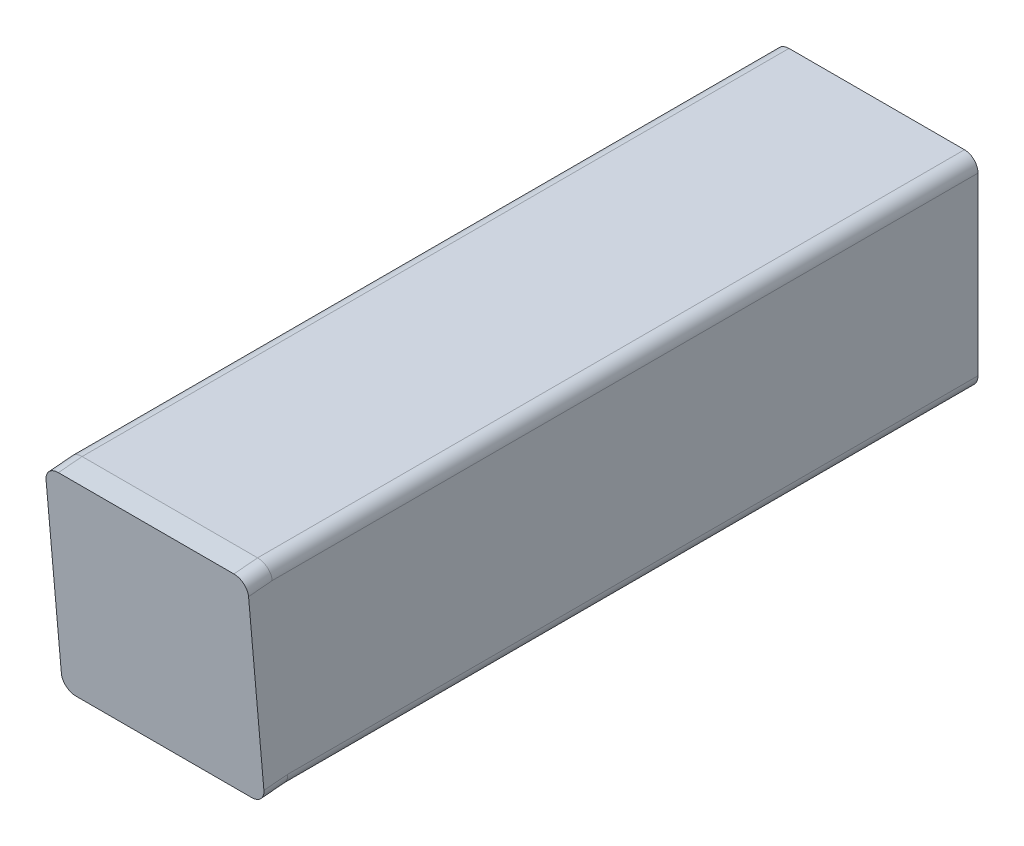
ISO-10303-21;
HEADER;
FILE_DESCRIPTION(('STEP AP214'),'2;1');
FILE_NAME('part.step','',(''),(''),'','','');
FILE_SCHEMA(('AUTOMOTIVE_DESIGN { 1 0 10303 214 1 1 1 1 }'));
ENDSEC;
DATA;
#1=APPLICATION_CONTEXT('core data for automotive mechanical design processes');
#2=APPLICATION_PROTOCOL_DEFINITION('international standard','automotive_design',2000,#1);
#3=PRODUCT_CONTEXT('',#1,'mechanical');
#4=PRODUCT('Part','Part','',(#3));
#5=PRODUCT_RELATED_PRODUCT_CATEGORY('part','',(#4));
#6=PRODUCT_DEFINITION_FORMATION('','',#4);
#7=PRODUCT_DEFINITION_CONTEXT('part definition',#1,'design');
#8=PRODUCT_DEFINITION('design','',#6,#7);
#9=PRODUCT_DEFINITION_SHAPE('','',#8);
#10=(LENGTH_UNIT() NAMED_UNIT(*) SI_UNIT(.MILLI.,.METRE.));
#11=(NAMED_UNIT(*) PLANE_ANGLE_UNIT() SI_UNIT($,.RADIAN.));
#12=(NAMED_UNIT(*) SI_UNIT($,.STERADIAN.) SOLID_ANGLE_UNIT());
#13=UNCERTAINTY_MEASURE_WITH_UNIT(LENGTH_MEASURE(1.E-05),#10,'distance_accuracy_value','');
#14=(GEOMETRIC_REPRESENTATION_CONTEXT(3) GLOBAL_UNCERTAINTY_ASSIGNED_CONTEXT((#13)) GLOBAL_UNIT_ASSIGNED_CONTEXT((#10,
#11,#12)) REPRESENTATION_CONTEXT('',''));
#15=CARTESIAN_POINT('',(0.,0.,0.));
#16=DIRECTION('',(0.,0.,1.));
#17=DIRECTION('',(1.,0.,0.));
#18=AXIS2_PLACEMENT_3D('',#15,#16,#17);
#19=CARTESIAN_POINT('',(2.54,-35.56,0.));
#20=DIRECTION('',(0.,0.,1.));
#21=DIRECTION('',(1.,0.,0.));
#22=AXIS2_PLACEMENT_3D('',#19,#20,#21);
#23=PLANE('',#22);
#24=CARTESIAN_POINT('',(2.54,-35.56,0.));
#25=DIRECTION('',(0.,0.,1.));
#26=DIRECTION('',(1.,0.,0.));
#27=AXIS2_PLACEMENT_3D('',#24,#25,#26);
#28=CIRCLE('',#27,2.54);
#29=CARTESIAN_POINT('',(0.,-35.56,0.));
#30=VERTEX_POINT('',#29);
#31=CARTESIAN_POINT('',(2.54000000000002,-38.1,0.));
#32=VERTEX_POINT('',#31);
#33=EDGE_CURVE('E360',#30,#32,#28,.T.);
#34=ORIENTED_EDGE('',*,*,#33,.F.);
#35=DIRECTION('',(0.,-1.,0.));
#36=VECTOR('',#35,1.);
#37=CARTESIAN_POINT('',(0.,-2.54000000000002,0.));
#38=LINE('',#37,#36);
#39=CARTESIAN_POINT('',(0.,-2.54000000000002,0.));
#40=VERTEX_POINT('',#39);
#41=EDGE_CURVE('E344',#40,#30,#38,.T.);
#42=ORIENTED_EDGE('',*,*,#41,.F.);
#43=CARTESIAN_POINT('',(2.54,-2.54,0.));
#44=DIRECTION('',(0.,0.,1.));
#45=DIRECTION('',(-1.,0.,0.));
#46=AXIS2_PLACEMENT_3D('',#43,#44,#45);
#47=CIRCLE('',#46,2.54);
#48=CARTESIAN_POINT('',(2.54000000000002,0.,0.));
#49=VERTEX_POINT('',#48);
#50=EDGE_CURVE('E347',#49,#40,#47,.T.);
#51=ORIENTED_EDGE('',*,*,#50,.F.);
#52=DIRECTION('',(-1.,0.,0.));
#53=VECTOR('',#52,1.);
#54=CARTESIAN_POINT('',(2.54000000000002,0.,0.));
#55=LINE('',#54,#53);
#56=CARTESIAN_POINT('',(35.56,0.,0.));
#57=VERTEX_POINT('',#56);
#58=EDGE_CURVE('E350',#57,#49,#55,.T.);
#59=ORIENTED_EDGE('',*,*,#58,.F.);
#60=CARTESIAN_POINT('',(35.56,-2.54,0.));
#61=DIRECTION('',(0.,0.,1.));
#62=DIRECTION('',(1.,0.,0.));
#63=AXIS2_PLACEMENT_3D('',#60,#61,#62);
#64=CIRCLE('',#63,2.54);
#65=CARTESIAN_POINT('',(38.1,-2.54000000000002,0.));
#66=VERTEX_POINT('',#65);
#67=EDGE_CURVE('E352',#66,#57,#64,.T.);
#68=ORIENTED_EDGE('',*,*,#67,.F.);
#69=DIRECTION('',(0.,1.,0.));
#70=VECTOR('',#69,1.);
#71=CARTESIAN_POINT('',(38.1,-2.54000000000002,0.));
#72=LINE('',#71,#70);
#73=CARTESIAN_POINT('',(38.1,-35.56,0.));
#74=VERTEX_POINT('',#73);
#75=EDGE_CURVE('E354',#74,#66,#72,.T.);
#76=ORIENTED_EDGE('',*,*,#75,.F.);
#77=CARTESIAN_POINT('',(35.56,-35.56,0.));
#78=DIRECTION('',(0.,0.,1.));
#79=DIRECTION('',(-1.,0.,0.));
#80=AXIS2_PLACEMENT_3D('',#77,#78,#79);
#81=CIRCLE('',#80,2.54);
#82=CARTESIAN_POINT('',(35.56,-38.1,0.));
#83=VERTEX_POINT('',#82);
#84=EDGE_CURVE('E357',#83,#74,#81,.T.);
#85=ORIENTED_EDGE('',*,*,#84,.F.);
#86=DIRECTION('',(1.,0.,0.));
#87=VECTOR('',#86,1.);
#88=CARTESIAN_POINT('',(2.54000000000002,-38.1,0.));
#89=LINE('',#88,#87);
#90=EDGE_CURVE('E323',#32,#83,#89,.T.);
#91=ORIENTED_EDGE('',*,*,#90,.F.);
#92=EDGE_LOOP('',(#34,#42,#51,#59,#68,#76,#85,#91));
#93=FACE_BOUND('',#92,.T.);
#94=CARTESIAN_POINT('',(5.3086,-32.7914,0.));
#95=DIRECTION('',(0.,0.,1.));
#96=DIRECTION('',(1.,0.,0.));
#97=AXIS2_PLACEMENT_3D('',#94,#95,#96);
#98=CIRCLE('',#97,2.54);
#99=CARTESIAN_POINT('',(2.7686,-32.7914,0.));
#100=VERTEX_POINT('',#99);
#101=CARTESIAN_POINT('',(5.30860000000002,-35.3314,0.));
#102=VERTEX_POINT('',#101);
#103=EDGE_CURVE('E402',#100,#102,#98,.T.);
#104=ORIENTED_EDGE('',*,*,#103,.T.);
#105=DIRECTION('',(1.,0.,0.));
#106=VECTOR('',#105,1.);
#107=CARTESIAN_POINT('',(5.30860000000002,-35.3314,0.));
#108=LINE('',#107,#106);
#109=CARTESIAN_POINT('',(32.7914,-35.3314,0.));
#110=VERTEX_POINT('',#109);
#111=EDGE_CURVE('E399',#102,#110,#108,.T.);
#112=ORIENTED_EDGE('',*,*,#111,.T.);
#113=CARTESIAN_POINT('',(32.7914,-32.7914,0.));
#114=DIRECTION('',(0.,0.,1.));
#115=DIRECTION('',(1.,0.,0.));
#116=AXIS2_PLACEMENT_3D('',#113,#114,#115);
#117=CIRCLE('',#116,2.54);
#118=CARTESIAN_POINT('',(35.3314,-32.7914,0.));
#119=VERTEX_POINT('',#118);
#120=EDGE_CURVE('E396',#110,#119,#117,.T.);
#121=ORIENTED_EDGE('',*,*,#120,.T.);
#122=DIRECTION('',(0.,1.,0.));
#123=VECTOR('',#122,1.);
#124=CARTESIAN_POINT('',(35.3314,-5.30860000000002,0.));
#125=LINE('',#124,#123);
#126=CARTESIAN_POINT('',(35.3314,-5.30860000000002,0.));
#127=VERTEX_POINT('',#126);
#128=EDGE_CURVE('E393',#119,#127,#125,.T.);
#129=ORIENTED_EDGE('',*,*,#128,.T.);
#130=CARTESIAN_POINT('',(32.7914,-5.3086,0.));
#131=DIRECTION('',(0.,0.,1.));
#132=DIRECTION('',(1.,0.,0.));
#133=AXIS2_PLACEMENT_3D('',#130,#131,#132);
#134=CIRCLE('',#133,2.54);
#135=CARTESIAN_POINT('',(32.7914,-2.7686,0.));
#136=VERTEX_POINT('',#135);
#137=EDGE_CURVE('E390',#127,#136,#134,.T.);
#138=ORIENTED_EDGE('',*,*,#137,.T.);
#139=DIRECTION('',(-1.,0.,0.));
#140=VECTOR('',#139,1.);
#141=CARTESIAN_POINT('',(5.30860000000002,-2.7686,0.));
#142=LINE('',#141,#140);
#143=CARTESIAN_POINT('',(5.30860000000002,-2.7686,0.));
#144=VERTEX_POINT('',#143);
#145=EDGE_CURVE('E387',#136,#144,#142,.T.);
#146=ORIENTED_EDGE('',*,*,#145,.T.);
#147=CARTESIAN_POINT('',(5.3086,-5.3086,0.));
#148=DIRECTION('',(0.,0.,1.));
#149=DIRECTION('',(1.,0.,0.));
#150=AXIS2_PLACEMENT_3D('',#147,#148,#149);
#151=CIRCLE('',#150,2.54);
#152=CARTESIAN_POINT('',(2.7686,-5.30860000000002,0.));
#153=VERTEX_POINT('',#152);
#154=EDGE_CURVE('E384',#144,#153,#151,.T.);
#155=ORIENTED_EDGE('',*,*,#154,.T.);
#156=DIRECTION('',(0.,-1.,0.));
#157=VECTOR('',#156,1.);
#158=CARTESIAN_POINT('',(2.7686,-5.30860000000002,0.));
#159=LINE('',#158,#157);
#160=EDGE_CURVE('E381',#153,#100,#159,.T.);
#161=ORIENTED_EDGE('',*,*,#160,.T.);
#162=EDGE_LOOP('',(#104,#112,#121,#129,#138,#146,#155,#161));
#163=FACE_BOUND('',#162,.T.);
#164=ADVANCED_FACE('F35',(#93,#163),#23,.F.);
#165=CARTESIAN_POINT('',(2.54,-35.56,133.));
#166=DIRECTION('',(0.,0.,-1.));
#167=DIRECTION('',(-1.,0.,0.));
#168=AXIS2_PLACEMENT_3D('',#165,#166,#167);
#169=CYLINDRICAL_SURFACE('',#168,2.54);
#170=DIRECTION('',(0.,0.,-1.));
#171=VECTOR('',#170,1.);
#172=CARTESIAN_POINT('',(2.54000000000002,-38.1,133.));
#173=LINE('',#172,#171);
#174=CARTESIAN_POINT('',(2.54000000000002,-38.1,129.666681919663));
#175=VERTEX_POINT('',#174);
#176=EDGE_CURVE('E43',#175,#32,#173,.T.);
#177=ORIENTED_EDGE('',*,*,#176,.F.);
#178=CARTESIAN_POINT('',(2.54,-35.56,129.888903125018));
#179=DIRECTION('',(0.,0.0871557427476518,-0.996194698091746));
#180=DIRECTION('',(0.,-0.996194698091746,-0.0871557427476518));
#181=AXIS2_PLACEMENT_3D('',#178,#179,#180);
#182=ELLIPSE('',#181,2.5497023873601,2.54);
#183=CARTESIAN_POINT('',(0.,-35.56,129.888903125018));
#184=VERTEX_POINT('',#183);
#185=EDGE_CURVE('E405',#175,#184,#182,.T.);
#186=ORIENTED_EDGE('',*,*,#185,.T.);
#187=DIRECTION('',(0.,0.,-1.));
#188=VECTOR('',#187,1.);
#189=CARTESIAN_POINT('',(0.,-35.56,133.));
#190=LINE('',#189,#188);
#191=EDGE_CURVE('E341',#184,#30,#190,.T.);
#192=ORIENTED_EDGE('',*,*,#191,.T.);
#193=ORIENTED_EDGE('',*,*,#33,.T.);
#194=EDGE_LOOP('',(#177,#186,#192,#193));
#195=FACE_BOUND('',#194,.T.);
#196=ADVANCED_FACE('F37',(#195),#169,.T.);
#197=CARTESIAN_POINT('',(2.54000000000002,-38.1,133.));
#198=DIRECTION('',(0.,1.,0.));
#199=DIRECTION('',(0.,0.,1.));
#200=AXIS2_PLACEMENT_3D('',#197,#198,#199);
#201=PLANE('',#200);
#202=DIRECTION('',(0.,0.,-1.));
#203=VECTOR('',#202,1.);
#204=CARTESIAN_POINT('',(35.56,-38.1,133.));
#205=LINE('',#204,#203);
#206=CARTESIAN_POINT('',(35.56,-38.1,129.666681919663));
#207=VERTEX_POINT('',#206);
#208=EDGE_CURVE('E320',#207,#83,#205,.T.);
#209=ORIENTED_EDGE('',*,*,#208,.F.);
#210=DIRECTION('',(1.,0.,0.));
#211=VECTOR('',#210,1.);
#212=CARTESIAN_POINT('',(0.,-38.1,129.666681919663));
#213=LINE('',#212,#211);
#214=EDGE_CURVE('E191',#175,#207,#213,.T.);
#215=ORIENTED_EDGE('',*,*,#214,.F.);
#216=ORIENTED_EDGE('',*,*,#176,.T.);
#217=ORIENTED_EDGE('',*,*,#90,.T.);
#218=EDGE_LOOP('',(#209,#215,#216,#217));
#219=FACE_BOUND('',#218,.T.);
#220=ADVANCED_FACE('F309',(#219),#201,.F.);
#221=CARTESIAN_POINT('',(35.56,-35.56,133.));
#222=DIRECTION('',(0.,0.,-1.));
#223=DIRECTION('',(-1.,0.,0.));
#224=AXIS2_PLACEMENT_3D('',#221,#222,#223);
#225=CYLINDRICAL_SURFACE('',#224,2.54);
#226=DIRECTION('',(0.,0.,-1.));
#227=VECTOR('',#226,1.);
#228=CARTESIAN_POINT('',(38.1,-35.56,133.));
#229=LINE('',#228,#227);
#230=CARTESIAN_POINT('',(38.1,-35.56,129.888903125018));
#231=VERTEX_POINT('',#230);
#232=EDGE_CURVE('E327',#231,#74,#229,.T.);
#233=ORIENTED_EDGE('',*,*,#232,.F.);
#234=CARTESIAN_POINT('',(35.56,-35.56,129.888903125018));
#235=DIRECTION('',(0.,0.0871557427476518,-0.996194698091746));
#236=DIRECTION('',(0.,-0.996194698091746,-0.0871557427476518));
#237=AXIS2_PLACEMENT_3D('',#234,#235,#236);
#238=ELLIPSE('',#237,2.5497023873601,2.54);
#239=EDGE_CURVE('E408',#231,#207,#238,.T.);
#240=ORIENTED_EDGE('',*,*,#239,.T.);
#241=ORIENTED_EDGE('',*,*,#208,.T.);
#242=ORIENTED_EDGE('',*,*,#84,.T.);
#243=EDGE_LOOP('',(#233,#240,#241,#242));
#244=FACE_BOUND('',#243,.T.);
#245=ADVANCED_FACE('F306',(#244),#225,.T.);
#246=CARTESIAN_POINT('',(38.1,-2.54000000000002,133.));
#247=DIRECTION('',(-1.,0.,0.));
#248=DIRECTION('',(0.,-1.,0.));
#249=AXIS2_PLACEMENT_3D('',#246,#247,#248);
#250=PLANE('',#249);
#251=DIRECTION('',(0.,0.,-1.));
#252=VECTOR('',#251,1.);
#253=CARTESIAN_POINT('',(38.1,-2.54000000000002,133.));
#254=LINE('',#253,#252);
#255=CARTESIAN_POINT('',(38.1,-2.54000000000001,132.777778794644));
#256=VERTEX_POINT('',#255);
#257=EDGE_CURVE('E329',#256,#66,#254,.T.);
#258=ORIENTED_EDGE('',*,*,#257,.F.);
#259=DIRECTION('',(0.,0.0871557427476518,-0.996194698091746));
#260=VECTOR('',#259,1.);
#261=CARTESIAN_POINT('',(38.1,-7.63559388855577,191.020683454472));
#262=LINE('',#261,#260);
#263=CARTESIAN_POINT('',(38.1,-2.93053084437793,137.241566771726));
#264=VERTEX_POINT('',#263);
#265=EDGE_CURVE('E216',#264,#256,#262,.T.);
#266=ORIENTED_EDGE('',*,*,#265,.F.);
#267=DIRECTION('',(0.,0.996194698091746,0.0871557427476584));
#268=VECTOR('',#267,1.);
#269=CARTESIAN_POINT('',(38.1,-35.9505308443787,134.352691102113));
#270=LINE('',#269,#268);
#271=CARTESIAN_POINT('',(38.1,-35.9505308443791,134.352691102113));
#272=VERTEX_POINT('',#271);
#273=EDGE_CURVE('E200',#272,#264,#270,.T.);
#274=ORIENTED_EDGE('',*,*,#273,.F.);
#275=DIRECTION('',(0.,0.0871557427476518,-0.996194698091746));
#276=VECTOR('',#275,1.);
#277=CARTESIAN_POINT('',(38.1,-40.6555938885558,188.131807784846));
#278=LINE('',#277,#276);
#279=EDGE_CURVE('E214',#272,#231,#278,.T.);
#280=ORIENTED_EDGE('',*,*,#279,.T.);
#281=ORIENTED_EDGE('',*,*,#232,.T.);
#282=ORIENTED_EDGE('',*,*,#75,.T.);
#283=EDGE_LOOP('',(#258,#266,#274,#280,#281,#282));
#284=FACE_BOUND('',#283,.T.);
#285=ADVANCED_FACE('F302',(#284),#250,.F.);
#286=CARTESIAN_POINT('',(35.56,-2.54,133.));
#287=DIRECTION('',(0.,0.,-1.));
#288=DIRECTION('',(-1.,0.,0.));
#289=AXIS2_PLACEMENT_3D('',#286,#287,#288);
#290=CYLINDRICAL_SURFACE('',#289,2.54);
#291=DIRECTION('',(0.,0.,-1.));
#292=VECTOR('',#291,1.);
#293=CARTESIAN_POINT('',(35.56,0.,133.));
#294=LINE('',#293,#292);
#295=CARTESIAN_POINT('',(35.56,0.,133.));
#296=VERTEX_POINT('',#295);
#297=EDGE_CURVE('E333',#296,#57,#294,.T.);
#298=ORIENTED_EDGE('',*,*,#297,.F.);
#299=CARTESIAN_POINT('',(35.56,-2.54,132.777778794644));
#300=DIRECTION('',(0.,0.0871557427476518,-0.996194698091746));
#301=DIRECTION('',(0.,-0.996194698091746,-0.0871557427476518));
#302=AXIS2_PLACEMENT_3D('',#299,#300,#301);
#303=ELLIPSE('',#302,2.5497023873601,2.54);
#304=EDGE_CURVE('E410',#296,#256,#303,.T.);
#305=ORIENTED_EDGE('',*,*,#304,.T.);
#306=ORIENTED_EDGE('',*,*,#257,.T.);
#307=ORIENTED_EDGE('',*,*,#67,.T.);
#308=EDGE_LOOP('',(#298,#305,#306,#307));
#309=FACE_BOUND('',#308,.T.);
#310=ADVANCED_FACE('F298',(#309),#290,.T.);
#311=CARTESIAN_POINT('',(2.54000000000002,0.,133.));
#312=DIRECTION('',(0.,-1.,0.));
#313=DIRECTION('',(0.,0.,-1.));
#314=AXIS2_PLACEMENT_3D('',#311,#312,#313);
#315=PLANE('',#314);
#316=ORIENTED_EDGE('',*,*,#58,.T.);
#317=DIRECTION('',(0.,0.,-1.));
#318=VECTOR('',#317,1.);
#319=CARTESIAN_POINT('',(2.54000000000002,0.,133.));
#320=LINE('',#319,#318);
#321=CARTESIAN_POINT('',(2.54,0.,133.));
#322=VERTEX_POINT('',#321);
#323=EDGE_CURVE('E336',#322,#49,#320,.T.);
#324=ORIENTED_EDGE('',*,*,#323,.F.);
#325=DIRECTION('',(-1.,0.,0.));
#326=VECTOR('',#325,1.);
#327=CARTESIAN_POINT('',(2.54000000000002,0.,133.));
#328=LINE('',#327,#326);
#329=EDGE_CURVE('E343',#296,#322,#328,.T.);
#330=ORIENTED_EDGE('',*,*,#329,.F.);
#331=ORIENTED_EDGE('',*,*,#297,.T.);
#332=EDGE_LOOP('',(#316,#324,#330,#331));
#333=FACE_BOUND('',#332,.T.);
#334=ADVANCED_FACE('F294',(#333),#315,.F.);
#335=CARTESIAN_POINT('',(2.54,-2.54,133.));
#336=DIRECTION('',(0.,0.,-1.));
#337=DIRECTION('',(-1.,0.,0.));
#338=AXIS2_PLACEMENT_3D('',#335,#336,#337);
#339=CYLINDRICAL_SURFACE('',#338,2.54);
#340=DIRECTION('',(0.,0.,-1.));
#341=VECTOR('',#340,1.);
#342=CARTESIAN_POINT('',(0.,-2.54000000000002,133.));
#343=LINE('',#342,#341);
#344=CARTESIAN_POINT('',(0.,-2.54000000000002,132.777778794644));
#345=VERTEX_POINT('',#344);
#346=EDGE_CURVE('E339',#345,#40,#343,.T.);
#347=ORIENTED_EDGE('',*,*,#346,.F.);
#348=CARTESIAN_POINT('',(2.54,-2.54,132.777778794644));
#349=DIRECTION('',(0.,0.0871557427476518,-0.996194698091746));
#350=DIRECTION('',(0.,-0.996194698091746,-0.0871557427476518));
#351=AXIS2_PLACEMENT_3D('',#348,#349,#350);
#352=ELLIPSE('',#351,2.5497023873601,2.54);
#353=EDGE_CURVE('E50',#345,#322,#352,.T.);
#354=ORIENTED_EDGE('',*,*,#353,.T.);
#355=ORIENTED_EDGE('',*,*,#323,.T.);
#356=ORIENTED_EDGE('',*,*,#50,.T.);
#357=EDGE_LOOP('',(#347,#354,#355,#356));
#358=FACE_BOUND('',#357,.T.);
#359=ADVANCED_FACE('F291',(#358),#339,.T.);
#360=CARTESIAN_POINT('',(0.,-2.54000000000002,133.));
#361=DIRECTION('',(1.,0.,0.));
#362=DIRECTION('',(0.,1.,0.));
#363=AXIS2_PLACEMENT_3D('',#360,#361,#362);
#364=PLANE('',#363);
#365=ORIENTED_EDGE('',*,*,#191,.F.);
#366=DIRECTION('',(0.,0.0871557427476518,-0.996194698091746));
#367=VECTOR('',#366,1.);
#368=CARTESIAN_POINT('',(0.,-40.6555938885558,188.131807784846));
#369=LINE('',#368,#367);
#370=CARTESIAN_POINT('',(0.,-35.9505308443791,134.352691102113));
#371=VERTEX_POINT('',#370);
#372=EDGE_CURVE('E181',#371,#184,#369,.T.);
#373=ORIENTED_EDGE('',*,*,#372,.F.);
#374=DIRECTION('',(0.,-0.996194698091746,-0.0871557427476584));
#375=VECTOR('',#374,1.);
#376=CARTESIAN_POINT('',(0.,-2.93053084437874,137.241566771739));
#377=LINE('',#376,#375);
#378=CARTESIAN_POINT('',(0.,-2.93053084437909,137.241566771739));
#379=VERTEX_POINT('',#378);
#380=EDGE_CURVE('E175',#379,#371,#377,.T.);
#381=ORIENTED_EDGE('',*,*,#380,.F.);
#382=DIRECTION('',(0.,0.0871557427476518,-0.996194698091746));
#383=VECTOR('',#382,1.);
#384=CARTESIAN_POINT('',(0.,-7.63559388855578,191.020683454472));
#385=LINE('',#384,#383);
#386=EDGE_CURVE('E167',#379,#345,#385,.T.);
#387=ORIENTED_EDGE('',*,*,#386,.T.);
#388=ORIENTED_EDGE('',*,*,#346,.T.);
#389=ORIENTED_EDGE('',*,*,#41,.T.);
#390=EDGE_LOOP('',(#365,#373,#381,#387,#388,#389));
#391=FACE_BOUND('',#390,.T.);
#392=ADVANCED_FACE('F180',(#391),#364,.F.);
#393=CARTESIAN_POINT('',(5.3086,-32.7914,133.));
#394=DIRECTION('',(0.,0.,-1.));
#395=DIRECTION('',(-1.,0.,0.));
#396=AXIS2_PLACEMENT_3D('',#393,#394,#395);
#397=CYLINDRICAL_SURFACE('',#396,2.54);
#398=CARTESIAN_POINT('',(5.3086,-32.7914,130.131124238856));
#399=DIRECTION('',(0.,0.0871557427476518,-0.996194698091746));
#400=DIRECTION('',(0.,-0.996194698091746,-0.0871557427476518));
#401=AXIS2_PLACEMENT_3D('',#398,#399,#400);
#402=ELLIPSE('',#401,2.5497023873601,2.54);
#403=CARTESIAN_POINT('',(5.30860000000002,-35.3314,129.9089030335));
#404=VERTEX_POINT('',#403);
#405=CARTESIAN_POINT('',(2.7686,-32.7914,130.131124238856));
#406=VERTEX_POINT('',#405);
#407=EDGE_CURVE('E414',#404,#406,#402,.T.);
#408=ORIENTED_EDGE('',*,*,#407,.F.);
#409=DIRECTION('',(0.,0.,-1.));
#410=VECTOR('',#409,1.);
#411=CARTESIAN_POINT('',(5.30860000000002,-35.3314,133.));
#412=LINE('',#411,#410);
#413=EDGE_CURVE('E363',#404,#102,#412,.T.);
#414=ORIENTED_EDGE('',*,*,#413,.T.);
#415=ORIENTED_EDGE('',*,*,#103,.F.);
#416=DIRECTION('',(0.,0.,-1.));
#417=VECTOR('',#416,1.);
#418=CARTESIAN_POINT('',(2.7686,-32.7914,133.));
#419=LINE('',#418,#417);
#420=EDGE_CURVE('E379',#406,#100,#419,.T.);
#421=ORIENTED_EDGE('',*,*,#420,.F.);
#422=EDGE_LOOP('',(#408,#414,#415,#421));
#423=FACE_BOUND('',#422,.T.);
#424=ADVANCED_FACE('F281',(#423),#397,.F.);
#425=CARTESIAN_POINT('',(5.30860000000002,-35.3314,133.));
#426=DIRECTION('',(0.,1.,0.));
#427=DIRECTION('',(0.,0.,1.));
#428=AXIS2_PLACEMENT_3D('',#425,#426,#427);
#429=PLANE('',#428);
#430=DIRECTION('',(-1.,0.,0.));
#431=VECTOR('',#430,1.);
#432=CARTESIAN_POINT('',(5.30860000000002,-35.3314,129.9089030335));
#433=LINE('',#432,#431);
#434=CARTESIAN_POINT('',(32.7914,-35.3314,129.9089030335));
#435=VERTEX_POINT('',#434);
#436=EDGE_CURVE('E417',#435,#404,#433,.T.);
#437=ORIENTED_EDGE('',*,*,#436,.F.);
#438=DIRECTION('',(0.,0.,-1.));
#439=VECTOR('',#438,1.);
#440=CARTESIAN_POINT('',(32.7914,-35.3314,133.));
#441=LINE('',#440,#439);
#442=EDGE_CURVE('E367',#435,#110,#441,.T.);
#443=ORIENTED_EDGE('',*,*,#442,.T.);
#444=ORIENTED_EDGE('',*,*,#111,.F.);
#445=ORIENTED_EDGE('',*,*,#413,.F.);
#446=EDGE_LOOP('',(#437,#443,#444,#445));
#447=FACE_BOUND('',#446,.T.);
#448=ADVANCED_FACE('F277',(#447),#429,.T.);
#449=CARTESIAN_POINT('',(32.7914,-32.7914,133.));
#450=DIRECTION('',(0.,0.,-1.));
#451=DIRECTION('',(-1.,0.,0.));
#452=AXIS2_PLACEMENT_3D('',#449,#450,#451);
#453=CYLINDRICAL_SURFACE('',#452,2.54);
#454=CARTESIAN_POINT('',(32.7914,-32.7914,130.131124238856));
#455=DIRECTION('',(0.,0.0871557427476518,-0.996194698091746));
#456=DIRECTION('',(0.,-0.996194698091746,-0.0871557427476518));
#457=AXIS2_PLACEMENT_3D('',#454,#455,#456);
#458=ELLIPSE('',#457,2.5497023873601,2.54);
#459=CARTESIAN_POINT('',(35.3314,-32.7914,130.131124238856));
#460=VERTEX_POINT('',#459);
#461=EDGE_CURVE('E420',#460,#435,#458,.T.);
#462=ORIENTED_EDGE('',*,*,#461,.F.);
#463=DIRECTION('',(0.,0.,-1.));
#464=VECTOR('',#463,1.);
#465=CARTESIAN_POINT('',(35.3314,-32.7914,133.));
#466=LINE('',#465,#464);
#467=EDGE_CURVE('E369',#460,#119,#466,.T.);
#468=ORIENTED_EDGE('',*,*,#467,.T.);
#469=ORIENTED_EDGE('',*,*,#120,.F.);
#470=ORIENTED_EDGE('',*,*,#442,.F.);
#471=EDGE_LOOP('',(#462,#468,#469,#470));
#472=FACE_BOUND('',#471,.T.);
#473=ADVANCED_FACE('F273',(#472),#453,.F.);
#474=CARTESIAN_POINT('',(35.3314,-5.30860000000002,133.));
#475=DIRECTION('',(-1.,0.,0.));
#476=DIRECTION('',(0.,0.,1.));
#477=AXIS2_PLACEMENT_3D('',#474,#475,#476);
#478=PLANE('',#477);
#479=DIRECTION('',(0.,-0.996194698091746,-0.0871557427476518));
#480=VECTOR('',#479,1.);
#481=CARTESIAN_POINT('',(35.3314,-5.26827521882033,132.539085642019));
#482=LINE('',#481,#480);
#483=CARTESIAN_POINT('',(35.3314,-5.30860000000002,132.535557680806));
#484=VERTEX_POINT('',#483);
#485=EDGE_CURVE('E423',#484,#460,#482,.T.);
#486=ORIENTED_EDGE('',*,*,#485,.F.);
#487=DIRECTION('',(0.,0.,-1.));
#488=VECTOR('',#487,1.);
#489=CARTESIAN_POINT('',(35.3314,-5.30860000000002,133.));
#490=LINE('',#489,#488);
#491=EDGE_CURVE('E371',#484,#127,#490,.T.);
#492=ORIENTED_EDGE('',*,*,#491,.T.);
#493=ORIENTED_EDGE('',*,*,#128,.F.);
#494=ORIENTED_EDGE('',*,*,#467,.F.);
#495=EDGE_LOOP('',(#486,#492,#493,#494));
#496=FACE_BOUND('',#495,.T.);
#497=ADVANCED_FACE('F269',(#496),#478,.T.);
#498=CARTESIAN_POINT('',(32.7914,-5.3086,133.));
#499=DIRECTION('',(0.,0.,-1.));
#500=DIRECTION('',(-1.,0.,0.));
#501=AXIS2_PLACEMENT_3D('',#498,#499,#500);
#502=CYLINDRICAL_SURFACE('',#501,2.54);
#503=CARTESIAN_POINT('',(32.7914,-5.3086,132.535557680806));
#504=DIRECTION('',(0.,0.0871557427476518,-0.996194698091746));
#505=DIRECTION('',(0.,-0.996194698091746,-0.0871557427476518));
#506=AXIS2_PLACEMENT_3D('',#503,#504,#505);
#507=ELLIPSE('',#506,2.5497023873601,2.54);
#508=CARTESIAN_POINT('',(32.7914,-2.7686,132.757778886162));
#509=VERTEX_POINT('',#508);
#510=EDGE_CURVE('E426',#509,#484,#507,.T.);
#511=ORIENTED_EDGE('',*,*,#510,.F.);
#512=DIRECTION('',(0.,0.,-1.));
#513=VECTOR('',#512,1.);
#514=CARTESIAN_POINT('',(32.7914,-2.7686,133.));
#515=LINE('',#514,#513);
#516=EDGE_CURVE('E373',#509,#136,#515,.T.);
#517=ORIENTED_EDGE('',*,*,#516,.T.);
#518=ORIENTED_EDGE('',*,*,#137,.F.);
#519=ORIENTED_EDGE('',*,*,#491,.F.);
#520=EDGE_LOOP('',(#511,#517,#518,#519));
#521=FACE_BOUND('',#520,.T.);
#522=ADVANCED_FACE('F265',(#521),#502,.F.);
#523=CARTESIAN_POINT('',(5.30860000000002,-2.7686,133.));
#524=DIRECTION('',(0.,-1.,0.));
#525=DIRECTION('',(0.,0.,-1.));
#526=AXIS2_PLACEMENT_3D('',#523,#524,#525);
#527=PLANE('',#526);
#528=DIRECTION('',(1.,0.,0.));
#529=VECTOR('',#528,1.);
#530=CARTESIAN_POINT('',(5.30860000000002,-2.7686,132.757778886162));
#531=LINE('',#530,#529);
#532=CARTESIAN_POINT('',(5.30860000000002,-2.7686,132.757778886162));
#533=VERTEX_POINT('',#532);
#534=EDGE_CURVE('E429',#533,#509,#531,.T.);
#535=ORIENTED_EDGE('',*,*,#534,.F.);
#536=DIRECTION('',(0.,0.,-1.));
#537=VECTOR('',#536,1.);
#538=CARTESIAN_POINT('',(5.30860000000002,-2.7686,133.));
#539=LINE('',#538,#537);
#540=EDGE_CURVE('E375',#533,#144,#539,.T.);
#541=ORIENTED_EDGE('',*,*,#540,.T.);
#542=ORIENTED_EDGE('',*,*,#145,.F.);
#543=ORIENTED_EDGE('',*,*,#516,.F.);
#544=EDGE_LOOP('',(#535,#541,#542,#543));
#545=FACE_BOUND('',#544,.T.);
#546=ADVANCED_FACE('F261',(#545),#527,.T.);
#547=CARTESIAN_POINT('',(5.3086,-5.3086,133.));
#548=DIRECTION('',(0.,0.,-1.));
#549=DIRECTION('',(-1.,0.,0.));
#550=AXIS2_PLACEMENT_3D('',#547,#548,#549);
#551=CYLINDRICAL_SURFACE('',#550,2.54);
#552=CARTESIAN_POINT('',(5.3086,-5.3086,132.535557680806));
#553=DIRECTION('',(0.,0.0871557427476518,-0.996194698091746));
#554=DIRECTION('',(0.,-0.996194698091746,-0.0871557427476518));
#555=AXIS2_PLACEMENT_3D('',#552,#553,#554);
#556=ELLIPSE('',#555,2.5497023873601,2.54);
#557=CARTESIAN_POINT('',(2.7686,-5.30860000000002,132.535557680806));
#558=VERTEX_POINT('',#557);
#559=EDGE_CURVE('E194',#558,#533,#556,.T.);
#560=ORIENTED_EDGE('',*,*,#559,.F.);
#561=DIRECTION('',(0.,0.,-1.));
#562=VECTOR('',#561,1.);
#563=CARTESIAN_POINT('',(2.7686,-5.30860000000002,133.));
#564=LINE('',#563,#562);
#565=EDGE_CURVE('E377',#558,#153,#564,.T.);
#566=ORIENTED_EDGE('',*,*,#565,.T.);
#567=ORIENTED_EDGE('',*,*,#154,.F.);
#568=ORIENTED_EDGE('',*,*,#540,.F.);
#569=EDGE_LOOP('',(#560,#566,#567,#568));
#570=FACE_BOUND('',#569,.T.);
#571=ADVANCED_FACE('F258',(#570),#551,.F.);
#572=CARTESIAN_POINT('',(2.7686,-5.30860000000002,133.));
#573=DIRECTION('',(1.,0.,0.));
#574=DIRECTION('',(0.,0.,-1.));
#575=AXIS2_PLACEMENT_3D('',#572,#573,#574);
#576=PLANE('',#575);
#577=DIRECTION('',(0.,0.996194698091746,0.0871557427476518));
#578=VECTOR('',#577,1.);
#579=CARTESIAN_POINT('',(2.7686,-5.26827521882033,132.539085642019));
#580=LINE('',#579,#578);
#581=EDGE_CURVE('E11',#406,#558,#580,.T.);
#582=ORIENTED_EDGE('',*,*,#581,.F.);
#583=ORIENTED_EDGE('',*,*,#420,.T.);
#584=ORIENTED_EDGE('',*,*,#160,.F.);
#585=ORIENTED_EDGE('',*,*,#565,.F.);
#586=EDGE_LOOP('',(#582,#583,#584,#585));
#587=FACE_BOUND('',#586,.T.);
#588=ADVANCED_FACE('F255',(#587),#576,.T.);
#589=CARTESIAN_POINT('',(2.54000000000003,-2005.43665801951,-37.9550179972877));
#590=DIRECTION('',(0.,-0.0871557427476584,0.996194698091746));
#591=DIRECTION('',(0.,-0.996194698091746,-0.0871557427476584));
#592=AXIS2_PLACEMENT_3D('',#589,#590,#591);
#593=PLANE('',#592);
#594=ORIENTED_EDGE('',*,*,#380,.T.);
#595=CARTESIAN_POINT('',(2.54000000000001,-35.9505308443779,134.3526911021));
#596=DIRECTION('',(0.,-0.0871557427476519,0.996194698091746));
#597=DIRECTION('',(0.,-0.996194698091746,-0.0871557427476519));
#598=AXIS2_PLACEMENT_3D('',#595,#596,#597);
#599=ELLIPSE('',#598,2.5497023873601,2.54);
#600=CARTESIAN_POINT('',(2.54000000000002,-38.4905308443791,134.130469896757));
#601=VERTEX_POINT('',#600);
#602=EDGE_CURVE('E185',#371,#601,#599,.T.);
#603=ORIENTED_EDGE('',*,*,#602,.T.);
#604=DIRECTION('',(1.,0.,0.));
#605=VECTOR('',#604,1.);
#606=CARTESIAN_POINT('',(2.54000000000001,-38.4905308443791,134.130469896757));
#607=LINE('',#606,#605);
#608=CARTESIAN_POINT('',(35.56,-38.4905308443779,134.130469896744));
#609=VERTEX_POINT('',#608);
#610=EDGE_CURVE('E206',#601,#609,#607,.T.);
#611=ORIENTED_EDGE('',*,*,#610,.T.);
#612=CARTESIAN_POINT('',(35.56,-35.9505308443779,134.3526911021));
#613=DIRECTION('',(0.,-0.0871557427476519,0.996194698091746));
#614=DIRECTION('',(0.,-0.996194698091746,-0.0871557427476519));
#615=AXIS2_PLACEMENT_3D('',#612,#613,#614);
#616=ELLIPSE('',#615,2.5497023873601,2.54);
#617=EDGE_CURVE('E203',#609,#272,#616,.T.);
#618=ORIENTED_EDGE('',*,*,#617,.T.);
#619=ORIENTED_EDGE('',*,*,#273,.T.);
#620=CARTESIAN_POINT('',(35.56,-2.93053084437793,137.241566771726));
#621=DIRECTION('',(0.,-0.0871557427476519,0.996194698091746));
#622=DIRECTION('',(0.,-0.996194698091746,-0.0871557427476519));
#623=AXIS2_PLACEMENT_3D('',#620,#621,#622);
#624=ELLIPSE('',#623,2.5497023873601,2.54);
#625=CARTESIAN_POINT('',(35.56,-0.39053084437907,137.463787977095));
#626=VERTEX_POINT('',#625);
#627=EDGE_CURVE('E196',#264,#626,#624,.T.);
#628=ORIENTED_EDGE('',*,*,#627,.T.);
#629=DIRECTION('',(-1.,0.,0.));
#630=VECTOR('',#629,1.);
#631=CARTESIAN_POINT('',(35.56,-0.390530844379069,137.463787977095));
#632=LINE('',#631,#630);
#633=CARTESIAN_POINT('',(2.54,-0.390530844377929,137.463787977082));
#634=VERTEX_POINT('',#633);
#635=EDGE_CURVE('E190',#626,#634,#632,.T.);
#636=ORIENTED_EDGE('',*,*,#635,.T.);
#637=CARTESIAN_POINT('',(2.54,-2.93053084437793,137.241566771726));
#638=DIRECTION('',(0.,-0.0871557427476519,0.996194698091746));
#639=DIRECTION('',(0.,-0.996194698091746,-0.0871557427476519));
#640=AXIS2_PLACEMENT_3D('',#637,#638,#639);
#641=ELLIPSE('',#640,2.5497023873601,2.54);
#642=EDGE_CURVE('E171',#634,#379,#641,.T.);
#643=ORIENTED_EDGE('',*,*,#642,.T.);
#644=EDGE_LOOP('',(#594,#603,#611,#618,#619,#628,#636,#643));
#645=FACE_BOUND('',#644,.T.);
#646=ADVANCED_FACE('F188',(#645),#593,.T.);
#647=CARTESIAN_POINT('',(2.54,-7.63559388855577,191.020683454472));
#648=DIRECTION('',(0.,-0.0871557427476519,0.996194698091746));
#649=DIRECTION('',(0.,-0.996194698091746,-0.0871557427476519));
#650=AXIS2_PLACEMENT_3D('',#647,#648,#649);
#651=ELLIPSE('',#650,2.5497023873601,2.54);
#652=DIRECTION('',(0.,0.0871557427476518,-0.996194698091746));
#653=VECTOR('',#652,1.);
#654=SURFACE_OF_LINEAR_EXTRUSION('',#651,#653);
#655=ORIENTED_EDGE('',*,*,#642,.F.);
#656=DIRECTION('',(0.,0.0871557427476518,-0.996194698091746));
#657=VECTOR('',#656,1.);
#658=CARTESIAN_POINT('',(2.54,-5.09559388855577,191.242904659828));
#659=LINE('',#658,#657);
#660=EDGE_CURVE('E176',#634,#322,#659,.T.);
#661=ORIENTED_EDGE('',*,*,#660,.T.);
#662=ORIENTED_EDGE('',*,*,#353,.F.);
#663=ORIENTED_EDGE('',*,*,#386,.F.);
#664=EDGE_LOOP('',(#655,#661,#662,#663));
#665=FACE_BOUND('',#664,.T.);
#666=ADVANCED_FACE('F169',(#665),#654,.F.);
#667=CARTESIAN_POINT('',(35.56,-5.09559388855577,191.242904659828));
#668=DIRECTION('',(0.,-0.996194698091746,-0.0871557427476518));
#669=DIRECTION('',(0.,0.0871557427476519,-0.996194698091746));
#670=AXIS2_PLACEMENT_3D('',#667,#668,#669);
#671=PLANE('',#670);
#672=ORIENTED_EDGE('',*,*,#635,.F.);
#673=DIRECTION('',(0.,0.0871557427476518,-0.996194698091746));
#674=VECTOR('',#673,1.);
#675=CARTESIAN_POINT('',(35.56,-5.09559388855577,191.242904659828));
#676=LINE('',#675,#674);
#677=EDGE_CURVE('E218',#626,#296,#676,.T.);
#678=ORIENTED_EDGE('',*,*,#677,.T.);
#679=ORIENTED_EDGE('',*,*,#329,.T.);
#680=ORIENTED_EDGE('',*,*,#660,.F.);
#681=EDGE_LOOP('',(#672,#678,#679,#680));
#682=FACE_BOUND('',#681,.T.);
#683=ADVANCED_FACE('F230',(#682),#671,.F.);
#684=CARTESIAN_POINT('',(35.56,-7.63559388855577,191.020683454472));
#685=DIRECTION('',(0.,-0.0871557427476519,0.996194698091746));
#686=DIRECTION('',(0.,-0.996194698091746,-0.0871557427476519));
#687=AXIS2_PLACEMENT_3D('',#684,#685,#686);
#688=ELLIPSE('',#687,2.5497023873601,2.54);
#689=DIRECTION('',(0.,0.0871557427476518,-0.996194698091746));
#690=VECTOR('',#689,1.);
#691=SURFACE_OF_LINEAR_EXTRUSION('',#688,#690);
#692=ORIENTED_EDGE('',*,*,#627,.F.);
#693=ORIENTED_EDGE('',*,*,#265,.T.);
#694=ORIENTED_EDGE('',*,*,#304,.F.);
#695=ORIENTED_EDGE('',*,*,#677,.F.);
#696=EDGE_LOOP('',(#692,#693,#694,#695));
#697=FACE_BOUND('',#696,.T.);
#698=ADVANCED_FACE('F234',(#697),#691,.F.);
#699=CARTESIAN_POINT('',(35.56,-40.6555938885558,188.131807784846));
#700=DIRECTION('',(0.,-0.0871557427476519,0.996194698091746));
#701=DIRECTION('',(0.,-0.996194698091746,-0.0871557427476519));
#702=AXIS2_PLACEMENT_3D('',#699,#700,#701);
#703=ELLIPSE('',#702,2.5497023873601,2.54);
#704=DIRECTION('',(0.,0.0871557427476518,-0.996194698091746));
#705=VECTOR('',#704,1.);
#706=SURFACE_OF_LINEAR_EXTRUSION('',#703,#705);
#707=ORIENTED_EDGE('',*,*,#617,.F.);
#708=DIRECTION('',(0.,0.0871557427476518,-0.996194698091746));
#709=VECTOR('',#708,1.);
#710=CARTESIAN_POINT('',(35.56,-43.1955938885558,187.90958657949));
#711=LINE('',#710,#709);
#712=EDGE_CURVE('E212',#609,#207,#711,.T.);
#713=ORIENTED_EDGE('',*,*,#712,.T.);
#714=ORIENTED_EDGE('',*,*,#239,.F.);
#715=ORIENTED_EDGE('',*,*,#279,.F.);
#716=EDGE_LOOP('',(#707,#713,#714,#715));
#717=FACE_BOUND('',#716,.T.);
#718=ADVANCED_FACE('F238',(#717),#706,.F.);
#719=CARTESIAN_POINT('',(2.54000000000002,-43.1955938885558,187.90958657949));
#720=DIRECTION('',(0.,0.996194698091746,0.0871557427476518));
#721=DIRECTION('',(0.,-0.0871557427476519,0.996194698091746));
#722=AXIS2_PLACEMENT_3D('',#719,#720,#721);
#723=PLANE('',#722);
#724=ORIENTED_EDGE('',*,*,#610,.F.);
#725=DIRECTION('',(0.,0.0871557427476518,-0.996194698091746));
#726=VECTOR('',#725,1.);
#727=CARTESIAN_POINT('',(2.54000000000002,-43.1955938885558,187.90958657949));
#728=LINE('',#727,#726);
#729=EDGE_CURVE('E210',#601,#175,#728,.T.);
#730=ORIENTED_EDGE('',*,*,#729,.T.);
#731=ORIENTED_EDGE('',*,*,#214,.T.);
#732=ORIENTED_EDGE('',*,*,#712,.F.);
#733=EDGE_LOOP('',(#724,#730,#731,#732));
#734=FACE_BOUND('',#733,.T.);
#735=ADVANCED_FACE('F242',(#734),#723,.F.);
#736=CARTESIAN_POINT('',(2.54000000000001,-40.6555938885558,188.131807784846));
#737=DIRECTION('',(0.,-0.0871557427476519,0.996194698091746));
#738=DIRECTION('',(0.,-0.996194698091746,-0.0871557427476519));
#739=AXIS2_PLACEMENT_3D('',#736,#737,#738);
#740=ELLIPSE('',#739,2.5497023873601,2.54);
#741=DIRECTION('',(0.,0.0871557427476518,-0.996194698091746));
#742=VECTOR('',#741,1.);
#743=SURFACE_OF_LINEAR_EXTRUSION('',#740,#742);
#744=ORIENTED_EDGE('',*,*,#602,.F.);
#745=ORIENTED_EDGE('',*,*,#372,.T.);
#746=ORIENTED_EDGE('',*,*,#185,.F.);
#747=ORIENTED_EDGE('',*,*,#729,.F.);
#748=EDGE_LOOP('',(#744,#745,#746,#747));
#749=FACE_BOUND('',#748,.T.);
#750=ADVANCED_FACE('F249',(#749),#743,.F.);
#751=CARTESIAN_POINT('',(2.54000000000001,-35.56,129.888903125018));
#752=DIRECTION('',(0.,-0.0871557427476519,0.996194698091746));
#753=DIRECTION('',(0.,-0.996194698091746,-0.0871557427476519));
#754=AXIS2_PLACEMENT_3D('',#751,#752,#753);
#755=PLANE('',#754);
#756=ORIENTED_EDGE('',*,*,#407,.T.);
#757=ORIENTED_EDGE('',*,*,#581,.T.);
#758=ORIENTED_EDGE('',*,*,#559,.T.);
#759=ORIENTED_EDGE('',*,*,#534,.T.);
#760=ORIENTED_EDGE('',*,*,#510,.T.);
#761=ORIENTED_EDGE('',*,*,#485,.T.);
#762=ORIENTED_EDGE('',*,*,#461,.T.);
#763=ORIENTED_EDGE('',*,*,#436,.T.);
#764=EDGE_LOOP('',(#756,#757,#758,#759,#760,#761,#762,#763));
#765=FACE_BOUND('',#764,.T.);
#766=ADVANCED_FACE('F231',(#765),#755,.F.);
#767=CLOSED_SHELL('',(#164,#196,#220,#245,#285,#310,#334,#359,#392,#424,#448,#473,#497,#522,
#546,#571,#588,#646,#666,#683,#698,#718,#735,#750,#766));
#768=MANIFOLD_SOLID_BREP('B2',#767);
#769=ADVANCED_BREP_SHAPE_REPRESENTATION('',(#18,#768),#14);
#770=SHAPE_DEFINITION_REPRESENTATION(#9,#769);
ENDSEC;
END-ISO-10303-21;
